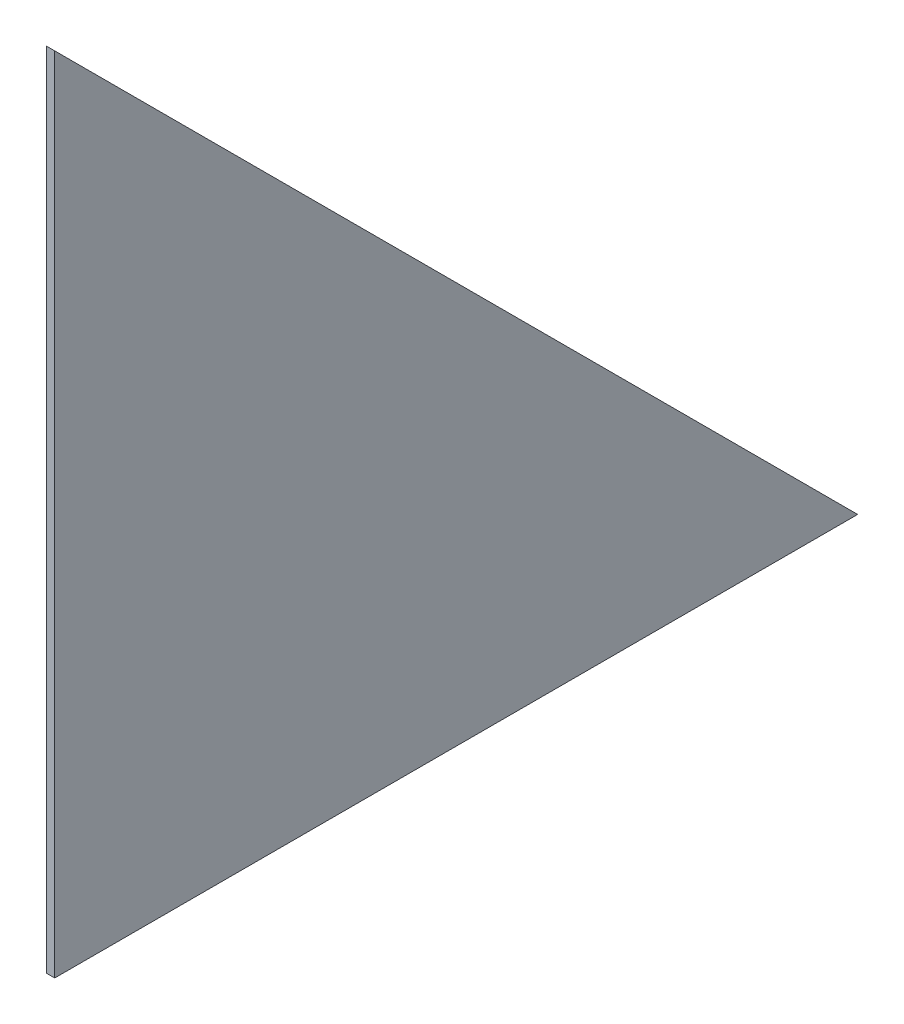
ISO-10303-21;
HEADER;
FILE_DESCRIPTION(('STEP AP214'),'2;1');
FILE_NAME('part.step','',(''),(''),'','','');
FILE_SCHEMA(('AUTOMOTIVE_DESIGN { 1 0 10303 214 1 1 1 1 }'));
ENDSEC;
DATA;
#1=APPLICATION_CONTEXT('core data for automotive mechanical design processes');
#2=APPLICATION_PROTOCOL_DEFINITION('international standard','automotive_design',2000,#1);
#3=PRODUCT_CONTEXT('',#1,'mechanical');
#4=PRODUCT('Part','Part','',(#3));
#5=PRODUCT_RELATED_PRODUCT_CATEGORY('part','',(#4));
#6=PRODUCT_DEFINITION_FORMATION('','',#4);
#7=PRODUCT_DEFINITION_CONTEXT('part definition',#1,'design');
#8=PRODUCT_DEFINITION('design','',#6,#7);
#9=PRODUCT_DEFINITION_SHAPE('','',#8);
#10=(LENGTH_UNIT() NAMED_UNIT(*) SI_UNIT(.MILLI.,.METRE.));
#11=(NAMED_UNIT(*) PLANE_ANGLE_UNIT() SI_UNIT($,.RADIAN.));
#12=(NAMED_UNIT(*) SI_UNIT($,.STERADIAN.) SOLID_ANGLE_UNIT());
#13=UNCERTAINTY_MEASURE_WITH_UNIT(LENGTH_MEASURE(1.E-05),#10,'distance_accuracy_value','');
#14=(GEOMETRIC_REPRESENTATION_CONTEXT(3) GLOBAL_UNCERTAINTY_ASSIGNED_CONTEXT((#13)) GLOBAL_UNIT_ASSIGNED_CONTEXT((#10,
#11,#12)) REPRESENTATION_CONTEXT('',''));
#15=CARTESIAN_POINT('',(0.,0.,0.));
#16=DIRECTION('',(0.,0.,1.));
#17=DIRECTION('',(1.,0.,0.));
#18=AXIS2_PLACEMENT_3D('',#15,#16,#17);
#19=CARTESIAN_POINT('',(4.,0.,-382.));
#20=DIRECTION('',(0.,1.,0.));
#21=DIRECTION('',(0.,0.,1.));
#22=AXIS2_PLACEMENT_3D('',#19,#20,#21);
#23=PLANE('',#22);
#24=DIRECTION('',(0.,0.,-1.));
#25=VECTOR('',#24,1.);
#26=CARTESIAN_POINT('',(0.,0.,-382.));
#27=LINE('',#26,#25);
#28=CARTESIAN_POINT('',(0.,0.,0.));
#29=VERTEX_POINT('',#28);
#30=CARTESIAN_POINT('',(0.,0.,-382.));
#31=VERTEX_POINT('',#30);
#32=EDGE_CURVE('E95',#29,#31,#27,.T.);
#33=ORIENTED_EDGE('',*,*,#32,.T.);
#34=DIRECTION('',(-1.,0.,0.));
#35=VECTOR('',#34,1.);
#36=CARTESIAN_POINT('',(4.,0.,-382.));
#37=LINE('',#36,#35);
#38=CARTESIAN_POINT('',(4.,0.,-382.));
#39=VERTEX_POINT('',#38);
#40=EDGE_CURVE('E11',#39,#31,#37,.T.);
#41=ORIENTED_EDGE('',*,*,#40,.F.);
#42=DIRECTION('',(0.,0.,-1.));
#43=VECTOR('',#42,1.);
#44=CARTESIAN_POINT('',(4.,0.,-382.));
#45=LINE('',#44,#43);
#46=CARTESIAN_POINT('',(4.,0.,3.88578058618805E-13));
#47=VERTEX_POINT('',#46);
#48=EDGE_CURVE('E87',#47,#39,#45,.T.);
#49=ORIENTED_EDGE('',*,*,#48,.F.);
#50=DIRECTION('',(-1.,0.,0.));
#51=VECTOR('',#50,1.);
#52=CARTESIAN_POINT('',(4.,0.,3.88578058618805E-13));
#53=LINE('',#52,#51);
#54=EDGE_CURVE('E96',#47,#29,#53,.T.);
#55=ORIENTED_EDGE('',*,*,#54,.T.);
#56=EDGE_LOOP('',(#33,#41,#49,#55));
#57=FACE_BOUND('',#56,.T.);
#58=ADVANCED_FACE('F45',(#57),#23,.F.);
#59=CARTESIAN_POINT('',(4.,382.,0.));
#60=DIRECTION('',(0.,-0.707106781186547,0.707106781186547));
#61=DIRECTION('',(0.,-0.707106781186548,-0.707106781186548));
#62=AXIS2_PLACEMENT_3D('',#59,#60,#61);
#63=PLANE('',#62);
#64=DIRECTION('',(0.,0.707106781186548,0.707106781186548));
#65=VECTOR('',#64,1.);
#66=CARTESIAN_POINT('',(0.,382.,0.));
#67=LINE('',#66,#65);
#68=CARTESIAN_POINT('',(0.,382.,0.));
#69=VERTEX_POINT('',#68);
#70=EDGE_CURVE('E74',#31,#69,#67,.T.);
#71=ORIENTED_EDGE('',*,*,#70,.T.);
#72=DIRECTION('',(-1.,0.,0.));
#73=VECTOR('',#72,1.);
#74=CARTESIAN_POINT('',(4.,382.,0.));
#75=LINE('',#74,#73);
#76=CARTESIAN_POINT('',(4.,382.,0.));
#77=VERTEX_POINT('',#76);
#78=EDGE_CURVE('E54',#77,#69,#75,.T.);
#79=ORIENTED_EDGE('',*,*,#78,.F.);
#80=DIRECTION('',(0.,0.707106781186548,0.707106781186548));
#81=VECTOR('',#80,1.);
#82=CARTESIAN_POINT('',(4.,382.,0.));
#83=LINE('',#82,#81);
#84=EDGE_CURVE('E82',#39,#77,#83,.T.);
#85=ORIENTED_EDGE('',*,*,#84,.F.);
#86=ORIENTED_EDGE('',*,*,#40,.T.);
#87=EDGE_LOOP('',(#71,#79,#85,#86));
#88=FACE_BOUND('',#87,.T.);
#89=ADVANCED_FACE('F83',(#88),#63,.F.);
#90=CARTESIAN_POINT('',(4.,0.,3.88578058618805E-13));
#91=DIRECTION('',(0.,0.,-1.));
#92=DIRECTION('',(-1.,0.,0.));
#93=AXIS2_PLACEMENT_3D('',#90,#91,#92);
#94=PLANE('',#93);
#95=DIRECTION('',(0.,-1.,0.));
#96=VECTOR('',#95,1.);
#97=CARTESIAN_POINT('',(0.,0.,0.));
#98=LINE('',#97,#96);
#99=EDGE_CURVE('E79',#69,#29,#98,.T.);
#100=ORIENTED_EDGE('',*,*,#99,.T.);
#101=ORIENTED_EDGE('',*,*,#54,.F.);
#102=DIRECTION('',(0.,-1.,0.));
#103=VECTOR('',#102,1.);
#104=CARTESIAN_POINT('',(4.,0.,3.88578058618805E-13));
#105=LINE('',#104,#103);
#106=EDGE_CURVE('E62',#77,#47,#105,.T.);
#107=ORIENTED_EDGE('',*,*,#106,.F.);
#108=ORIENTED_EDGE('',*,*,#78,.T.);
#109=EDGE_LOOP('',(#100,#101,#107,#108));
#110=FACE_BOUND('',#109,.T.);
#111=ADVANCED_FACE('F110',(#110),#94,.F.);
#112=CARTESIAN_POINT('',(4.,0.,3.88578058618805E-13));
#113=DIRECTION('',(-1.,0.,0.));
#114=DIRECTION('',(0.,0.,1.));
#115=AXIS2_PLACEMENT_3D('',#112,#113,#114);
#116=PLANE('',#115);
#117=ORIENTED_EDGE('',*,*,#48,.T.);
#118=ORIENTED_EDGE('',*,*,#84,.T.);
#119=ORIENTED_EDGE('',*,*,#106,.T.);
#120=EDGE_LOOP('',(#117,#118,#119));
#121=FACE_BOUND('',#120,.T.);
#122=ADVANCED_FACE('F90',(#121),#116,.F.);
#123=CARTESIAN_POINT('',(0.,0.,0.));
#124=DIRECTION('',(-1.,0.,0.));
#125=DIRECTION('',(0.,0.,1.));
#126=AXIS2_PLACEMENT_3D('',#123,#124,#125);
#127=PLANE('',#126);
#128=ORIENTED_EDGE('',*,*,#32,.F.);
#129=ORIENTED_EDGE('',*,*,#99,.F.);
#130=ORIENTED_EDGE('',*,*,#70,.F.);
#131=EDGE_LOOP('',(#128,#129,#130));
#132=FACE_BOUND('',#131,.T.);
#133=ADVANCED_FACE('F111',(#132),#127,.T.);
#134=CLOSED_SHELL('',(#58,#89,#111,#122,#133));
#135=MANIFOLD_SOLID_BREP('B2',#134);
#136=ADVANCED_BREP_SHAPE_REPRESENTATION('',(#18,#135),#14);
#137=SHAPE_DEFINITION_REPRESENTATION(#9,#136);
ENDSEC;
END-ISO-10303-21;
